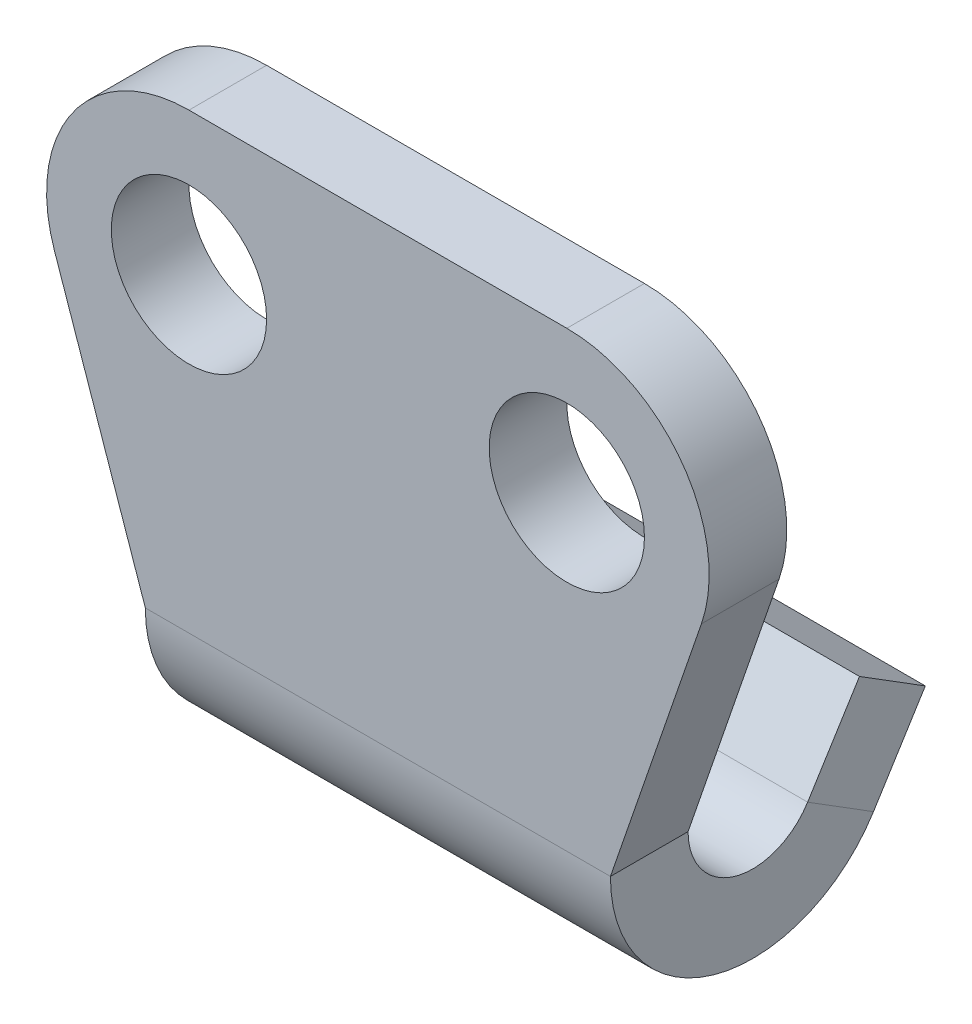
ISO-10303-21;
HEADER;
FILE_DESCRIPTION(('STEP AP214'),'2;1');
FILE_NAME('part.step','',(''),(''),'','','');
FILE_SCHEMA(('AUTOMOTIVE_DESIGN { 1 0 10303 214 1 1 1 1 }'));
ENDSEC;
DATA;
#1=APPLICATION_CONTEXT('core data for automotive mechanical design processes');
#2=APPLICATION_PROTOCOL_DEFINITION('international standard','automotive_design',2000,#1);
#3=PRODUCT_CONTEXT('',#1,'mechanical');
#4=PRODUCT('Part','Part','',(#3));
#5=PRODUCT_RELATED_PRODUCT_CATEGORY('part','',(#4));
#6=PRODUCT_DEFINITION_FORMATION('','',#4);
#7=PRODUCT_DEFINITION_CONTEXT('part definition',#1,'design');
#8=PRODUCT_DEFINITION('design','',#6,#7);
#9=PRODUCT_DEFINITION_SHAPE('','',#8);
#10=(LENGTH_UNIT() NAMED_UNIT(*) SI_UNIT(.MILLI.,.METRE.));
#11=(NAMED_UNIT(*) PLANE_ANGLE_UNIT() SI_UNIT($,.RADIAN.));
#12=(NAMED_UNIT(*) SI_UNIT($,.STERADIAN.) SOLID_ANGLE_UNIT());
#13=UNCERTAINTY_MEASURE_WITH_UNIT(LENGTH_MEASURE(1.E-05),#10,'distance_accuracy_value','');
#14=(GEOMETRIC_REPRESENTATION_CONTEXT(3) GLOBAL_UNCERTAINTY_ASSIGNED_CONTEXT((#13)) GLOBAL_UNIT_ASSIGNED_CONTEXT((#10,
#11,#12)) REPRESENTATION_CONTEXT('',''));
#15=CARTESIAN_POINT('',(0.,0.,0.));
#16=DIRECTION('',(0.,0.,1.));
#17=DIRECTION('',(1.,0.,0.));
#18=AXIS2_PLACEMENT_3D('',#15,#16,#17);
#19=CARTESIAN_POINT('',(-8.98498238705069,-17.5,-3.));
#20=DIRECTION('',(-0.945518575599317,-0.325568154457157,0.));
#21=DIRECTION('',(0.325568154457157,-0.945518575599317,0.));
#22=AXIS2_PLACEMENT_3D('',#19,#20,#21);
#23=PLANE('',#22);
#24=DIRECTION('',(0.325568154457157,-0.945518575599317,0.));
#25=VECTOR('',#24,1.);
#26=CARTESIAN_POINT('',(-8.98498238705069,-17.5,0.));
#27=LINE('',#26,#25);
#28=CARTESIAN_POINT('',(-12.5003521657962,-7.29062484951436,0.));
#29=VERTEX_POINT('',#28);
#30=CARTESIAN_POINT('',(-8.98498238705069,-17.5,0.));
#31=VERTEX_POINT('',#30);
#32=EDGE_CURVE('E211',#29,#31,#27,.T.);
#33=ORIENTED_EDGE('',*,*,#32,.F.);
#34=DIRECTION('',(0.,0.,1.));
#35=VECTOR('',#34,1.);
#36=CARTESIAN_POINT('',(-12.5003521657962,-7.29062484951436,-3.));
#37=LINE('',#36,#35);
#38=CARTESIAN_POINT('',(-12.5003521657962,-7.29062484951436,-3.));
#39=VERTEX_POINT('',#38);
#40=EDGE_CURVE('E68',#39,#29,#37,.T.);
#41=ORIENTED_EDGE('',*,*,#40,.F.);
#42=DIRECTION('',(0.325568154457157,-0.945518575599317,0.));
#43=VECTOR('',#42,1.);
#44=CARTESIAN_POINT('',(-8.98498238705069,-17.5,-3.));
#45=LINE('',#44,#43);
#46=CARTESIAN_POINT('',(-8.98498238705069,-17.5,-3.00000000000001));
#47=VERTEX_POINT('',#46);
#48=EDGE_CURVE('E221',#39,#47,#45,.T.);
#49=ORIENTED_EDGE('',*,*,#48,.T.);
#50=DIRECTION('',(0.,0.,1.));
#51=VECTOR('',#50,1.);
#52=CARTESIAN_POINT('',(-8.98498238705069,-17.5,-3.));
#53=LINE('',#52,#51);
#54=EDGE_CURVE('E13',#47,#31,#53,.T.);
#55=ORIENTED_EDGE('',*,*,#54,.T.);
#56=EDGE_LOOP('',(#33,#41,#49,#55));
#57=FACE_BOUND('',#56,.T.);
#58=ADVANCED_FACE('F59',(#57),#23,.T.);
#59=CARTESIAN_POINT('',(-7.3,-5.5,-3.));
#60=DIRECTION('',(0.,0.,1.));
#61=DIRECTION('',(1.,0.,0.));
#62=AXIS2_PLACEMENT_3D('',#59,#60,#61);
#63=CYLINDRICAL_SURFACE('',#62,5.5);
#64=CARTESIAN_POINT('',(-7.3,-5.5,0.));
#65=DIRECTION('',(0.,0.,1.));
#66=DIRECTION('',(1.,0.,0.));
#67=AXIS2_PLACEMENT_3D('',#64,#65,#66);
#68=CIRCLE('',#67,5.5);
#69=CARTESIAN_POINT('',(-7.3,0.,0.));
#70=VERTEX_POINT('',#69);
#71=EDGE_CURVE('E234',#70,#29,#68,.T.);
#72=ORIENTED_EDGE('',*,*,#71,.F.);
#73=DIRECTION('',(0.,0.,1.));
#74=VECTOR('',#73,1.);
#75=CARTESIAN_POINT('',(-7.3,0.,-3.));
#76=LINE('',#75,#74);
#77=CARTESIAN_POINT('',(-7.3,0.,-3.));
#78=VERTEX_POINT('',#77);
#79=EDGE_CURVE('E239',#78,#70,#76,.T.);
#80=ORIENTED_EDGE('',*,*,#79,.F.);
#81=CARTESIAN_POINT('',(-7.3,-5.5,-3.));
#82=DIRECTION('',(0.,0.,1.));
#83=DIRECTION('',(1.,0.,0.));
#84=AXIS2_PLACEMENT_3D('',#81,#82,#83);
#85=CIRCLE('',#84,5.5);
#86=EDGE_CURVE('E219',#78,#39,#85,.T.);
#87=ORIENTED_EDGE('',*,*,#86,.T.);
#88=ORIENTED_EDGE('',*,*,#40,.T.);
#89=EDGE_LOOP('',(#72,#80,#87,#88));
#90=FACE_BOUND('',#89,.T.);
#91=ADVANCED_FACE('F283',(#90),#63,.T.);
#92=CARTESIAN_POINT('',(-7.3,0.,-3.));
#93=DIRECTION('',(0.,1.,0.));
#94=DIRECTION('',(-1.,0.,0.));
#95=AXIS2_PLACEMENT_3D('',#92,#93,#94);
#96=PLANE('',#95);
#97=DIRECTION('',(-1.,0.,0.));
#98=VECTOR('',#97,1.);
#99=CARTESIAN_POINT('',(-7.3,0.,0.));
#100=LINE('',#99,#98);
#101=CARTESIAN_POINT('',(7.3,0.,0.));
#102=VERTEX_POINT('',#101);
#103=EDGE_CURVE('E231',#102,#70,#100,.T.);
#104=ORIENTED_EDGE('',*,*,#103,.F.);
#105=DIRECTION('',(0.,0.,1.));
#106=VECTOR('',#105,1.);
#107=CARTESIAN_POINT('',(7.3,0.,-3.));
#108=LINE('',#107,#106);
#109=CARTESIAN_POINT('',(7.3,0.,-3.));
#110=VERTEX_POINT('',#109);
#111=EDGE_CURVE('E241',#110,#102,#108,.T.);
#112=ORIENTED_EDGE('',*,*,#111,.F.);
#113=DIRECTION('',(-1.,0.,0.));
#114=VECTOR('',#113,1.);
#115=CARTESIAN_POINT('',(-7.3,0.,-3.));
#116=LINE('',#115,#114);
#117=EDGE_CURVE('E216',#110,#78,#116,.T.);
#118=ORIENTED_EDGE('',*,*,#117,.T.);
#119=ORIENTED_EDGE('',*,*,#79,.T.);
#120=EDGE_LOOP('',(#104,#112,#118,#119));
#121=FACE_BOUND('',#120,.T.);
#122=ADVANCED_FACE('F288',(#121),#96,.T.);
#123=CARTESIAN_POINT('',(7.3,-5.5,-3.));
#124=DIRECTION('',(0.,0.,1.));
#125=DIRECTION('',(1.,0.,0.));
#126=AXIS2_PLACEMENT_3D('',#123,#124,#125);
#127=CYLINDRICAL_SURFACE('',#126,5.5);
#128=CARTESIAN_POINT('',(7.3,-5.5,0.));
#129=DIRECTION('',(0.,0.,1.));
#130=DIRECTION('',(1.,0.,0.));
#131=AXIS2_PLACEMENT_3D('',#128,#129,#130);
#132=CIRCLE('',#131,5.5);
#133=CARTESIAN_POINT('',(12.5003521657962,-7.29062484951437,0.));
#134=VERTEX_POINT('',#133);
#135=EDGE_CURVE('E228',#134,#102,#132,.T.);
#136=ORIENTED_EDGE('',*,*,#135,.F.);
#137=DIRECTION('',(0.,0.,1.));
#138=VECTOR('',#137,1.);
#139=CARTESIAN_POINT('',(12.5003521657962,-7.29062484951437,-3.));
#140=LINE('',#139,#138);
#141=CARTESIAN_POINT('',(12.5003521657962,-7.29062484951437,-3.));
#142=VERTEX_POINT('',#141);
#143=EDGE_CURVE('E113',#142,#134,#140,.T.);
#144=ORIENTED_EDGE('',*,*,#143,.F.);
#145=CARTESIAN_POINT('',(7.3,-5.5,-3.));
#146=DIRECTION('',(0.,0.,1.));
#147=DIRECTION('',(1.,0.,0.));
#148=AXIS2_PLACEMENT_3D('',#145,#146,#147);
#149=CIRCLE('',#148,5.5);
#150=EDGE_CURVE('E214',#142,#110,#149,.T.);
#151=ORIENTED_EDGE('',*,*,#150,.T.);
#152=ORIENTED_EDGE('',*,*,#111,.T.);
#153=EDGE_LOOP('',(#136,#144,#151,#152));
#154=FACE_BOUND('',#153,.T.);
#155=ADVANCED_FACE('F294',(#154),#127,.T.);
#156=CARTESIAN_POINT('',(8.9849823870507,-17.5,-3.));
#157=DIRECTION('',(0.945518575599317,-0.325568154457157,0.));
#158=DIRECTION('',(0.325568154457157,0.945518575599317,0.));
#159=AXIS2_PLACEMENT_3D('',#156,#157,#158);
#160=PLANE('',#159);
#161=DIRECTION('',(0.325568154457157,0.945518575599317,0.));
#162=VECTOR('',#161,1.);
#163=CARTESIAN_POINT('',(8.9849823870507,-17.5,0.));
#164=LINE('',#163,#162);
#165=CARTESIAN_POINT('',(8.9849823870507,-17.5,0.));
#166=VERTEX_POINT('',#165);
#167=EDGE_CURVE('E225',#166,#134,#164,.T.);
#168=ORIENTED_EDGE('',*,*,#167,.F.);
#169=DIRECTION('',(0.,0.,1.));
#170=VECTOR('',#169,1.);
#171=CARTESIAN_POINT('',(8.9849823870507,-17.5,-3.));
#172=LINE('',#171,#170);
#173=CARTESIAN_POINT('',(8.98498238705069,-17.5,-3.00000000000001));
#174=VERTEX_POINT('',#173);
#175=EDGE_CURVE('E63',#174,#166,#172,.T.);
#176=ORIENTED_EDGE('',*,*,#175,.F.);
#177=DIRECTION('',(0.325568154457157,0.945518575599317,0.));
#178=VECTOR('',#177,1.);
#179=CARTESIAN_POINT('',(8.9849823870507,-17.5,-3.));
#180=LINE('',#179,#178);
#181=EDGE_CURVE('E210',#174,#142,#180,.T.);
#182=ORIENTED_EDGE('',*,*,#181,.T.);
#183=ORIENTED_EDGE('',*,*,#143,.T.);
#184=EDGE_LOOP('',(#168,#176,#182,#183));
#185=FACE_BOUND('',#184,.T.);
#186=ADVANCED_FACE('F61',(#185),#160,.T.);
#187=CARTESIAN_POINT('',(-7.3,-5.5,-3.));
#188=DIRECTION('',(0.,0.,1.));
#189=DIRECTION('',(1.,0.,0.));
#190=AXIS2_PLACEMENT_3D('',#187,#188,#189);
#191=PLANE('',#190);
#192=CARTESIAN_POINT('',(-7.3,-5.5,-3.));
#193=DIRECTION('',(0.,0.,1.));
#194=DIRECTION('',(1.,0.,0.));
#195=AXIS2_PLACEMENT_3D('',#192,#193,#194);
#196=CIRCLE('',#195,3.);
#197=CARTESIAN_POINT('',(-4.3,-5.5,-3.));
#198=VERTEX_POINT('',#197);
#199=EDGE_CURVE('E196',#198,#198,#196,.T.);
#200=ORIENTED_EDGE('',*,*,#199,.T.);
#201=EDGE_LOOP('',(#200));
#202=FACE_BOUND('',#201,.T.);
#203=CARTESIAN_POINT('',(7.3,-5.5,-3.));
#204=DIRECTION('',(0.,0.,1.));
#205=DIRECTION('',(1.,0.,0.));
#206=AXIS2_PLACEMENT_3D('',#203,#204,#205);
#207=CIRCLE('',#206,3.);
#208=CARTESIAN_POINT('',(10.3,-5.5,-3.));
#209=VERTEX_POINT('',#208);
#210=EDGE_CURVE('E202',#209,#209,#207,.T.);
#211=ORIENTED_EDGE('',*,*,#210,.T.);
#212=EDGE_LOOP('',(#211));
#213=FACE_BOUND('',#212,.T.);
#214=DIRECTION('',(1.,0.,0.));
#215=VECTOR('',#214,1.);
#216=CARTESIAN_POINT('',(8.9849823870507,-17.5,-3.));
#217=LINE('',#216,#215);
#218=EDGE_CURVE('E208',#47,#174,#217,.T.);
#219=ORIENTED_EDGE('',*,*,#218,.F.);
#220=ORIENTED_EDGE('',*,*,#48,.F.);
#221=ORIENTED_EDGE('',*,*,#86,.F.);
#222=ORIENTED_EDGE('',*,*,#117,.F.);
#223=ORIENTED_EDGE('',*,*,#150,.F.);
#224=ORIENTED_EDGE('',*,*,#181,.F.);
#225=EDGE_LOOP('',(#219,#220,#221,#222,#223,#224));
#226=FACE_BOUND('',#225,.T.);
#227=ADVANCED_FACE('F262',(#202,#213,#226),#191,.F.);
#228=CARTESIAN_POINT('',(-7.3,-5.5,0.));
#229=DIRECTION('',(0.,0.,1.));
#230=DIRECTION('',(1.,0.,0.));
#231=AXIS2_PLACEMENT_3D('',#228,#229,#230);
#232=PLANE('',#231);
#233=CARTESIAN_POINT('',(-7.3,-5.5,0.));
#234=DIRECTION('',(0.,0.,1.));
#235=DIRECTION('',(1.,0.,0.));
#236=AXIS2_PLACEMENT_3D('',#233,#234,#235);
#237=CIRCLE('',#236,3.);
#238=CARTESIAN_POINT('',(-4.3,-5.5,0.));
#239=VERTEX_POINT('',#238);
#240=EDGE_CURVE('E190',#239,#239,#237,.T.);
#241=ORIENTED_EDGE('',*,*,#240,.F.);
#242=EDGE_LOOP('',(#241));
#243=FACE_BOUND('',#242,.T.);
#244=CARTESIAN_POINT('',(7.3,-5.5,0.));
#245=DIRECTION('',(0.,0.,1.));
#246=DIRECTION('',(1.,0.,0.));
#247=AXIS2_PLACEMENT_3D('',#244,#245,#246);
#248=CIRCLE('',#247,3.);
#249=CARTESIAN_POINT('',(10.3,-5.5,0.));
#250=VERTEX_POINT('',#249);
#251=EDGE_CURVE('E199',#250,#250,#248,.T.);
#252=ORIENTED_EDGE('',*,*,#251,.F.);
#253=EDGE_LOOP('',(#252));
#254=FACE_BOUND('',#253,.T.);
#255=DIRECTION('',(1.,0.,0.));
#256=VECTOR('',#255,1.);
#257=CARTESIAN_POINT('',(8.9849823870507,-17.5,0.));
#258=LINE('',#257,#256);
#259=EDGE_CURVE('E205',#31,#166,#258,.T.);
#260=ORIENTED_EDGE('',*,*,#259,.T.);
#261=ORIENTED_EDGE('',*,*,#167,.T.);
#262=ORIENTED_EDGE('',*,*,#135,.T.);
#263=ORIENTED_EDGE('',*,*,#103,.T.);
#264=ORIENTED_EDGE('',*,*,#71,.T.);
#265=ORIENTED_EDGE('',*,*,#32,.T.);
#266=EDGE_LOOP('',(#260,#261,#262,#263,#264,#265));
#267=FACE_BOUND('',#266,.T.);
#268=ADVANCED_FACE('F251',(#243,#254,#267),#232,.T.);
#269=CARTESIAN_POINT('',(7.3,-5.5,-3.));
#270=DIRECTION('',(0.,0.,1.));
#271=DIRECTION('',(1.,0.,0.));
#272=AXIS2_PLACEMENT_3D('',#269,#270,#271);
#273=CYLINDRICAL_SURFACE('',#272,3.);
#274=ORIENTED_EDGE('',*,*,#210,.F.);
#275=EDGE_LOOP('',(#274));
#276=FACE_BOUND('',#275,.T.);
#277=ORIENTED_EDGE('',*,*,#251,.T.);
#278=EDGE_LOOP('',(#277));
#279=FACE_BOUND('',#278,.T.);
#280=ADVANCED_FACE('F308',(#276,#279),#273,.F.);
#281=CARTESIAN_POINT('',(-7.3,-5.5,-3.));
#282=DIRECTION('',(0.,0.,1.));
#283=DIRECTION('',(1.,0.,0.));
#284=AXIS2_PLACEMENT_3D('',#281,#282,#283);
#285=CYLINDRICAL_SURFACE('',#284,3.);
#286=ORIENTED_EDGE('',*,*,#199,.F.);
#287=EDGE_LOOP('',(#286));
#288=FACE_BOUND('',#287,.T.);
#289=ORIENTED_EDGE('',*,*,#240,.T.);
#290=EDGE_LOOP('',(#289));
#291=FACE_BOUND('',#290,.T.);
#292=ADVANCED_FACE('F314',(#288,#291),#285,.F.);
#293=CARTESIAN_POINT('',(8.98498238705069,-17.5,-5.50000000000001));
#294=DIRECTION('',(1.,0.,0.));
#295=DIRECTION('',(0.,0.,-1.));
#296=AXIS2_PLACEMENT_3D('',#293,#294,#295);
#297=PLANE('',#296);
#298=DIRECTION('',(0.,0.529919264233206,0.848048096156426));
#299=VECTOR('',#298,1.);
#300=CARTESIAN_POINT('',(8.98498238705069,-20.4145559532826,-10.1642645288603));
#301=LINE('',#300,#299);
#302=CARTESIAN_POINT('',(8.98498238705069,-18.824798160583,-7.62012024039107));
#303=VERTEX_POINT('',#302);
#304=CARTESIAN_POINT('',(8.98498238705069,-20.4145559532826,-10.1642645288603));
#305=VERTEX_POINT('',#304);
#306=EDGE_CURVE('E165',#303,#305,#301,.F.);
#307=ORIENTED_EDGE('',*,*,#306,.F.);
#308=CARTESIAN_POINT('',(8.98498238705069,-17.5,-5.50000000000001));
#309=DIRECTION('',(-1.,0.,0.));
#310=DIRECTION('',(0.,0.,1.));
#311=AXIS2_PLACEMENT_3D('',#308,#309,#310);
#312=CIRCLE('',#311,2.5);
#313=EDGE_CURVE('E169',#174,#303,#312,.F.);
#314=ORIENTED_EDGE('',*,*,#313,.F.);
#315=ORIENTED_EDGE('',*,*,#175,.T.);
#316=CARTESIAN_POINT('',(8.98498238705069,-17.5,-5.50000000000001));
#317=DIRECTION('',(-1.,0.,0.));
#318=DIRECTION('',(0.,0.,1.));
#319=AXIS2_PLACEMENT_3D('',#316,#317,#318);
#320=CIRCLE('',#319,5.5);
#321=EDGE_CURVE('E187',#166,#305,#320,.F.);
#322=ORIENTED_EDGE('',*,*,#321,.T.);
#323=EDGE_LOOP('',(#307,#314,#315,#322));
#324=FACE_BOUND('',#323,.T.);
#325=ADVANCED_FACE('F248',(#324),#297,.T.);
#326=CARTESIAN_POINT('',(-8.98498238705069,-17.5,-5.50000000000001));
#327=DIRECTION('',(1.,0.,0.));
#328=DIRECTION('',(0.,0.,-1.));
#329=AXIS2_PLACEMENT_3D('',#326,#327,#328);
#330=PLANE('',#329);
#331=CARTESIAN_POINT('',(-8.98498238705069,-17.5,-5.50000000000001));
#332=DIRECTION('',(-1.,0.,0.));
#333=DIRECTION('',(0.,0.,1.));
#334=AXIS2_PLACEMENT_3D('',#331,#332,#333);
#335=CIRCLE('',#334,2.5);
#336=CARTESIAN_POINT('',(-8.98498238705069,-18.824798160583,-7.62012024039107));
#337=VERTEX_POINT('',#336);
#338=EDGE_CURVE('E166',#337,#47,#335,.T.);
#339=ORIENTED_EDGE('',*,*,#338,.F.);
#340=DIRECTION('',(0.,0.529919264233206,0.848048096156426));
#341=VECTOR('',#340,1.);
#342=CARTESIAN_POINT('',(-8.98498238705069,-18.824798160583,-7.62012024039107));
#343=LINE('',#342,#341);
#344=CARTESIAN_POINT('',(-8.98498238705069,-20.4145559532826,-10.1642645288603));
#345=VERTEX_POINT('',#344);
#346=EDGE_CURVE('E181',#337,#345,#343,.F.);
#347=ORIENTED_EDGE('',*,*,#346,.T.);
#348=CARTESIAN_POINT('',(-8.98498238705069,-17.5,-5.50000000000001));
#349=DIRECTION('',(-1.,0.,0.));
#350=DIRECTION('',(0.,0.,1.));
#351=AXIS2_PLACEMENT_3D('',#348,#349,#350);
#352=CIRCLE('',#351,5.5);
#353=EDGE_CURVE('E191',#345,#31,#352,.T.);
#354=ORIENTED_EDGE('',*,*,#353,.T.);
#355=ORIENTED_EDGE('',*,*,#54,.F.);
#356=EDGE_LOOP('',(#339,#347,#354,#355));
#357=FACE_BOUND('',#356,.T.);
#358=ADVANCED_FACE('F256',(#357),#330,.F.);
#359=CARTESIAN_POINT('',(-8.98498238705069,-17.5,-5.50000000000001));
#360=DIRECTION('',(-1.,0.,0.));
#361=DIRECTION('',(0.,-0.529919264233206,-0.848048096156426));
#362=AXIS2_PLACEMENT_3D('',#359,#360,#361);
#363=CYLINDRICAL_SURFACE('',#362,5.5);
#364=ORIENTED_EDGE('',*,*,#259,.F.);
#365=ORIENTED_EDGE('',*,*,#353,.F.);
#366=DIRECTION('',(-1.,0.,0.));
#367=VECTOR('',#366,1.);
#368=CARTESIAN_POINT('',(8.98498238705069,-20.4145559532826,-10.1642645288603));
#369=LINE('',#368,#367);
#370=EDGE_CURVE('E179',#345,#305,#369,.F.);
#371=ORIENTED_EDGE('',*,*,#370,.T.);
#372=ORIENTED_EDGE('',*,*,#321,.F.);
#373=EDGE_LOOP('',(#364,#365,#371,#372));
#374=FACE_BOUND('',#373,.T.);
#375=ADVANCED_FACE('F253',(#374),#363,.T.);
#376=CARTESIAN_POINT('',(-8.98498238705069,-17.5,-5.50000000000001));
#377=DIRECTION('',(-1.,0.,0.));
#378=DIRECTION('',(0.,-0.529919264233206,-0.848048096156426));
#379=AXIS2_PLACEMENT_3D('',#376,#377,#378);
#380=CYLINDRICAL_SURFACE('',#379,2.5);
#381=ORIENTED_EDGE('',*,*,#218,.T.);
#382=ORIENTED_EDGE('',*,*,#313,.T.);
#383=DIRECTION('',(-1.,0.,0.));
#384=VECTOR('',#383,1.);
#385=CARTESIAN_POINT('',(8.98498238705069,-18.824798160583,-7.62012024039107));
#386=LINE('',#385,#384);
#387=EDGE_CURVE('E184',#303,#337,#386,.T.);
#388=ORIENTED_EDGE('',*,*,#387,.T.);
#389=ORIENTED_EDGE('',*,*,#338,.T.);
#390=EDGE_LOOP('',(#381,#382,#388,#389));
#391=FACE_BOUND('',#390,.T.);
#392=ADVANCED_FACE('F265',(#391),#380,.F.);
#393=CARTESIAN_POINT('',(-8.98498238705069,-15.0875724599555,-13.4929332519674));
#394=DIRECTION('',(1.,0.,0.));
#395=DIRECTION('',(0.,0.,-1.));
#396=AXIS2_PLACEMENT_3D('',#393,#394,#395);
#397=PLANE('',#396);
#398=DIRECTION('',(0.,-0.848048096156426,0.529919264233206));
#399=VECTOR('',#398,1.);
#400=CARTESIAN_POINT('',(-8.98498238705069,-13.4978146672559,-10.9487889634981));
#401=LINE('',#400,#399);
#402=CARTESIAN_POINT('',(-8.98498238705069,-15.6191763571117,-9.62321505919259));
#403=VERTEX_POINT('',#402);
#404=EDGE_CURVE('E176',#337,#403,#401,.F.);
#405=ORIENTED_EDGE('',*,*,#404,.T.);
#406=DIRECTION('',(0.,-0.529919264233206,-0.848048096156425));
#407=VECTOR('',#406,1.);
#408=CARTESIAN_POINT('',(-8.98498238705069,-17.2089341498113,-12.1673593476619));
#409=LINE('',#408,#407);
#410=CARTESIAN_POINT('',(-8.98498238705069,-17.2089341498113,-12.1673593476619));
#411=VERTEX_POINT('',#410);
#412=EDGE_CURVE('E76',#403,#411,#409,.T.);
#413=ORIENTED_EDGE('',*,*,#412,.T.);
#414=DIRECTION('',(0.,0.848048096156426,-0.529919264233206));
#415=VECTOR('',#414,1.);
#416=CARTESIAN_POINT('',(-8.98498238705069,-16.5707374373462,-12.5661489137706));
#417=LINE('',#416,#415);
#418=EDGE_CURVE('E160',#345,#411,#417,.T.);
#419=ORIENTED_EDGE('',*,*,#418,.F.);
#420=ORIENTED_EDGE('',*,*,#346,.F.);
#421=EDGE_LOOP('',(#405,#413,#419,#420));
#422=FACE_BOUND('',#421,.T.);
#423=ADVANCED_FACE('F269',(#422),#397,.F.);
#424=CARTESIAN_POINT('',(8.98498238705069,-27.8082939023019,-5.54414428846928));
#425=DIRECTION('',(-1.,0.,0.));
#426=DIRECTION('',(0.,0.,1.));
#427=AXIS2_PLACEMENT_3D('',#424,#425,#426);
#428=PLANE('',#427);
#429=DIRECTION('',(0.,-0.848048096156426,0.529919264233206));
#430=VECTOR('',#429,1.);
#431=CARTESIAN_POINT('',(8.98498238705069,-16.5707374373462,-12.5661489137706));
#432=LINE('',#431,#430);
#433=CARTESIAN_POINT('',(8.98498238705069,-17.2089341498113,-12.1673593476619));
#434=VERTEX_POINT('',#433);
#435=EDGE_CURVE('E157',#434,#305,#432,.T.);
#436=ORIENTED_EDGE('',*,*,#435,.F.);
#437=DIRECTION('',(0.,-0.529919264233206,-0.848048096156425));
#438=VECTOR('',#437,1.);
#439=CARTESIAN_POINT('',(8.98498238705069,-17.2089341498113,-12.1673593476619));
#440=LINE('',#439,#438);
#441=CARTESIAN_POINT('',(8.98498238705069,-15.6191763571117,-9.62321505919259));
#442=VERTEX_POINT('',#441);
#443=EDGE_CURVE('E144',#442,#434,#440,.T.);
#444=ORIENTED_EDGE('',*,*,#443,.F.);
#445=DIRECTION('',(0.,0.848048096156426,-0.529919264233206));
#446=VECTOR('',#445,1.);
#447=CARTESIAN_POINT('',(8.98498238705069,-26.2185361096023,-3.00000000000001));
#448=LINE('',#447,#446);
#449=EDGE_CURVE('E171',#442,#303,#448,.F.);
#450=ORIENTED_EDGE('',*,*,#449,.T.);
#451=ORIENTED_EDGE('',*,*,#306,.T.);
#452=EDGE_LOOP('',(#436,#444,#450,#451));
#453=FACE_BOUND('',#452,.T.);
#454=ADVANCED_FACE('F163',(#453),#428,.F.);
#455=CARTESIAN_POINT('',(0.,-16.5707374373462,-12.5661489137706));
#456=DIRECTION('',(0.,0.529919264233206,0.848048096156426));
#457=DIRECTION('',(0.,-0.848048096156426,0.529919264233206));
#458=AXIS2_PLACEMENT_3D('',#455,#456,#457);
#459=PLANE('',#458);
#460=ORIENTED_EDGE('',*,*,#418,.T.);
#461=DIRECTION('',(1.,0.,0.));
#462=VECTOR('',#461,1.);
#463=CARTESIAN_POINT('',(-12.8,-17.2089341498113,-12.1673593476619));
#464=LINE('',#463,#462);
#465=EDGE_CURVE('E147',#411,#434,#464,.T.);
#466=ORIENTED_EDGE('',*,*,#465,.T.);
#467=ORIENTED_EDGE('',*,*,#435,.T.);
#468=ORIENTED_EDGE('',*,*,#370,.F.);
#469=EDGE_LOOP('',(#460,#466,#467,#468));
#470=FACE_BOUND('',#469,.T.);
#471=ADVANCED_FACE('F155',(#470),#459,.F.);
#472=CARTESIAN_POINT('',(0.,-14.9809796446466,-10.0220046253013));
#473=DIRECTION('',(0.,0.529919264233206,0.848048096156426));
#474=DIRECTION('',(0.,-0.848048096156426,0.529919264233206));
#475=AXIS2_PLACEMENT_3D('',#472,#473,#474);
#476=PLANE('',#475);
#477=DIRECTION('',(1.,0.,0.));
#478=VECTOR('',#477,1.);
#479=CARTESIAN_POINT('',(-12.8,-15.6191763571117,-9.62321505919259));
#480=LINE('',#479,#478);
#481=EDGE_CURVE('E148',#403,#442,#480,.T.);
#482=ORIENTED_EDGE('',*,*,#481,.F.);
#483=ORIENTED_EDGE('',*,*,#404,.F.);
#484=ORIENTED_EDGE('',*,*,#387,.F.);
#485=ORIENTED_EDGE('',*,*,#449,.F.);
#486=EDGE_LOOP('',(#482,#483,#484,#485));
#487=FACE_BOUND('',#486,.T.);
#488=ADVANCED_FACE('F271',(#487),#476,.T.);
#489=CARTESIAN_POINT('',(-12.8,-17.2089341498113,-12.1673593476619));
#490=DIRECTION('',(0.,-0.848048096156425,0.529919264233206));
#491=DIRECTION('',(0.,-0.529919264233206,-0.848048096156425));
#492=AXIS2_PLACEMENT_3D('',#489,#490,#491);
#493=PLANE('',#492);
#494=ORIENTED_EDGE('',*,*,#481,.T.);
#495=ORIENTED_EDGE('',*,*,#443,.T.);
#496=ORIENTED_EDGE('',*,*,#465,.F.);
#497=ORIENTED_EDGE('',*,*,#412,.F.);
#498=EDGE_LOOP('',(#494,#495,#496,#497));
#499=FACE_BOUND('',#498,.T.);
#500=ADVANCED_FACE('F146',(#499),#493,.F.);
#501=CLOSED_SHELL('',(#58,#91,#122,#155,#186,#227,#268,#280,#292,#325,#358,#375,#392,#423,#454,
#471,#488,#500));
#502=MANIFOLD_SOLID_BREP('B2',#501);
#503=ADVANCED_BREP_SHAPE_REPRESENTATION('',(#18,#502),#14);
#504=SHAPE_DEFINITION_REPRESENTATION(#9,#503);
ENDSEC;
END-ISO-10303-21;
